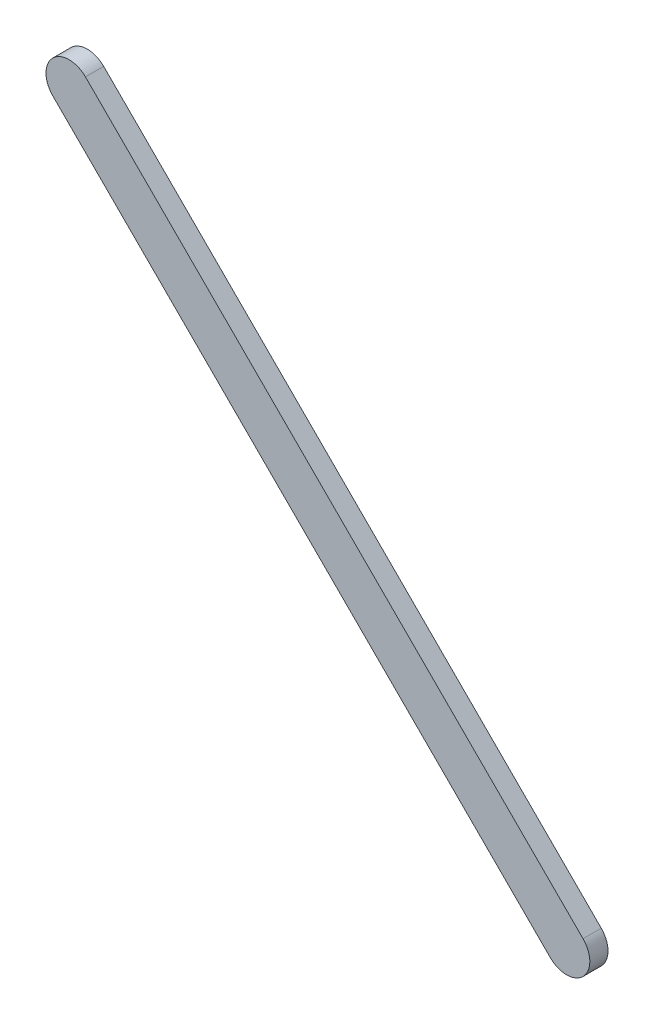
ISO-10303-21;
HEADER;
FILE_DESCRIPTION(('STEP AP214'),'2;1');
FILE_NAME('part.step','',(''),(''),'','','');
FILE_SCHEMA(('AUTOMOTIVE_DESIGN { 1 0 10303 214 1 1 1 1 }'));
ENDSEC;
DATA;
#1=APPLICATION_CONTEXT('core data for automotive mechanical design processes');
#2=APPLICATION_PROTOCOL_DEFINITION('international standard','automotive_design',2000,#1);
#3=PRODUCT_CONTEXT('',#1,'mechanical');
#4=PRODUCT('Part','Part','',(#3));
#5=PRODUCT_RELATED_PRODUCT_CATEGORY('part','',(#4));
#6=PRODUCT_DEFINITION_FORMATION('','',#4);
#7=PRODUCT_DEFINITION_CONTEXT('part definition',#1,'design');
#8=PRODUCT_DEFINITION('design','',#6,#7);
#9=PRODUCT_DEFINITION_SHAPE('','',#8);
#10=(LENGTH_UNIT() NAMED_UNIT(*) SI_UNIT(.MILLI.,.METRE.));
#11=(NAMED_UNIT(*) PLANE_ANGLE_UNIT() SI_UNIT($,.RADIAN.));
#12=(NAMED_UNIT(*) SI_UNIT($,.STERADIAN.) SOLID_ANGLE_UNIT());
#13=UNCERTAINTY_MEASURE_WITH_UNIT(LENGTH_MEASURE(1.E-05),#10,'distance_accuracy_value','');
#14=(GEOMETRIC_REPRESENTATION_CONTEXT(3) GLOBAL_UNCERTAINTY_ASSIGNED_CONTEXT((#13)) GLOBAL_UNIT_ASSIGNED_CONTEXT((#10,
#11,#12)) REPRESENTATION_CONTEXT('',''));
#15=CARTESIAN_POINT('',(0.,0.,0.));
#16=DIRECTION('',(0.,0.,1.));
#17=DIRECTION('',(1.,0.,0.));
#18=AXIS2_PLACEMENT_3D('',#15,#16,#17);
#19=CARTESIAN_POINT('',(85.29139406,56.4623966,0.));
#20=DIRECTION('',(0.707106781186548,0.707106781186547,0.));
#21=DIRECTION('',(0.707106781186547,-0.707106781186548,0.));
#22=AXIS2_PLACEMENT_3D('',#19,#20,#21);
#23=PLANE('',#22);
#24=DIRECTION('',(0.707106781186547,-0.707106781186548,0.));
#25=VECTOR('',#24,1.);
#26=CARTESIAN_POINT('',(85.29139406,56.4623966,0.1999996));
#27=LINE('',#26,#25);
#28=CARTESIAN_POINT('',(85.29139406,56.4623966,0.1999996));
#29=VERTEX_POINT('',#28);
#30=CARTESIAN_POINT('',(90.7523966,51.00139406,0.1999996));
#31=VERTEX_POINT('',#30);
#32=EDGE_CURVE('E11',#29,#31,#27,.T.);
#33=ORIENTED_EDGE('',*,*,#32,.F.);
#34=DIRECTION('',(0.,0.,1.));
#35=VECTOR('',#34,1.);
#36=CARTESIAN_POINT('',(85.29139406,56.4623966,0.));
#37=LINE('',#36,#35);
#38=CARTESIAN_POINT('',(85.29139406,56.4623966,0.));
#39=VERTEX_POINT('',#38);
#40=EDGE_CURVE('E24',#39,#29,#37,.T.);
#41=ORIENTED_EDGE('',*,*,#40,.F.);
#42=DIRECTION('',(0.707106781186547,-0.707106781186548,0.));
#43=VECTOR('',#42,1.);
#44=CARTESIAN_POINT('',(85.29139406,56.4623966,0.));
#45=LINE('',#44,#43);
#46=CARTESIAN_POINT('',(90.7523966,51.00139406,0.));
#47=VERTEX_POINT('',#46);
#48=EDGE_CURVE('E75',#39,#47,#45,.T.);
#49=ORIENTED_EDGE('',*,*,#48,.T.);
#50=DIRECTION('',(0.,0.,1.));
#51=VECTOR('',#50,1.);
#52=CARTESIAN_POINT('',(90.7523966,51.00139406,0.));
#53=LINE('',#52,#51);
#54=EDGE_CURVE('E37',#47,#31,#53,.T.);
#55=ORIENTED_EDGE('',*,*,#54,.T.);
#56=EDGE_LOOP('',(#33,#41,#49,#55));
#57=FACE_BOUND('',#56,.T.);
#58=ADVANCED_FACE('F17',(#57),#23,.F.);
#59=CARTESIAN_POINT('',(90.93200127,51.18099873,0.));
#60=DIRECTION('',(0.,0.,-1.));
#61=DIRECTION('',(-0.707106781186548,-0.707106781186548,0.));
#62=AXIS2_PLACEMENT_3D('',#59,#60,#61);
#63=CYLINDRICAL_SURFACE('',#62,0.253999360179541);
#64=CARTESIAN_POINT('',(90.93200127,51.18099873,0.1999996));
#65=DIRECTION('',(0.,0.,1.));
#66=DIRECTION('',(-0.707106781186548,-0.707106781186548,0.));
#67=AXIS2_PLACEMENT_3D('',#64,#65,#66);
#68=CIRCLE('',#67,0.253999360179541);
#69=CARTESIAN_POINT('',(91.11160594,51.3606034,0.1999996));
#70=VERTEX_POINT('',#69);
#71=EDGE_CURVE('E83',#31,#70,#68,.T.);
#72=ORIENTED_EDGE('',*,*,#71,.F.);
#73=ORIENTED_EDGE('',*,*,#54,.F.);
#74=CARTESIAN_POINT('',(90.93200127,51.18099873,0.));
#75=DIRECTION('',(0.,0.,1.));
#76=DIRECTION('',(-0.707106781186548,-0.707106781186548,0.));
#77=AXIS2_PLACEMENT_3D('',#74,#75,#76);
#78=CIRCLE('',#77,0.253999360179541);
#79=CARTESIAN_POINT('',(91.11160594,51.3606034,0.));
#80=VERTEX_POINT('',#79);
#81=EDGE_CURVE('E81',#47,#80,#78,.T.);
#82=ORIENTED_EDGE('',*,*,#81,.T.);
#83=DIRECTION('',(0.,0.,1.));
#84=VECTOR('',#83,1.);
#85=CARTESIAN_POINT('',(91.11160594,51.3606034,0.));
#86=LINE('',#85,#84);
#87=EDGE_CURVE('E67',#80,#70,#86,.T.);
#88=ORIENTED_EDGE('',*,*,#87,.T.);
#89=EDGE_LOOP('',(#72,#73,#82,#88));
#90=FACE_BOUND('',#89,.T.);
#91=ADVANCED_FACE('F89',(#90),#63,.T.);
#92=CARTESIAN_POINT('',(91.11160594,51.3606034,0.));
#93=DIRECTION('',(-0.707106781186549,-0.707106781186547,0.));
#94=DIRECTION('',(-0.707106781186547,0.707106781186549,0.));
#95=AXIS2_PLACEMENT_3D('',#92,#93,#94);
#96=PLANE('',#95);
#97=DIRECTION('',(-0.707106781186547,0.707106781186549,0.));
#98=VECTOR('',#97,1.);
#99=CARTESIAN_POINT('',(91.11160594,51.3606034,0.1999996));
#100=LINE('',#99,#98);
#101=CARTESIAN_POINT('',(85.6506034,56.82160594,0.1999996));
#102=VERTEX_POINT('',#101);
#103=EDGE_CURVE('E71',#70,#102,#100,.T.);
#104=ORIENTED_EDGE('',*,*,#103,.F.);
#105=ORIENTED_EDGE('',*,*,#87,.F.);
#106=DIRECTION('',(-0.707106781186547,0.707106781186549,0.));
#107=VECTOR('',#106,1.);
#108=CARTESIAN_POINT('',(91.11160594,51.3606034,0.));
#109=LINE('',#108,#107);
#110=CARTESIAN_POINT('',(85.6506034,56.82160594,0.));
#111=VERTEX_POINT('',#110);
#112=EDGE_CURVE('E63',#80,#111,#109,.T.);
#113=ORIENTED_EDGE('',*,*,#112,.T.);
#114=DIRECTION('',(0.,0.,1.));
#115=VECTOR('',#114,1.);
#116=CARTESIAN_POINT('',(85.6506034,56.82160594,0.));
#117=LINE('',#116,#115);
#118=EDGE_CURVE('E53',#111,#102,#117,.T.);
#119=ORIENTED_EDGE('',*,*,#118,.T.);
#120=EDGE_LOOP('',(#104,#105,#113,#119));
#121=FACE_BOUND('',#120,.T.);
#122=ADVANCED_FACE('F66',(#121),#96,.F.);
#123=CARTESIAN_POINT('',(85.47099873,56.64200127,0.));
#124=DIRECTION('',(0.,0.,-1.));
#125=DIRECTION('',(0.707106781186548,0.707106781186548,0.));
#126=AXIS2_PLACEMENT_3D('',#123,#124,#125);
#127=CYLINDRICAL_SURFACE('',#126,0.253999360179542);
#128=CARTESIAN_POINT('',(85.47099873,56.64200127,0.1999996));
#129=DIRECTION('',(0.,0.,1.));
#130=DIRECTION('',(0.707106781186548,0.707106781186548,0.));
#131=AXIS2_PLACEMENT_3D('',#128,#129,#130);
#132=CIRCLE('',#131,0.253999360179542);
#133=EDGE_CURVE('E59',#102,#29,#132,.T.);
#134=ORIENTED_EDGE('',*,*,#133,.F.);
#135=ORIENTED_EDGE('',*,*,#118,.F.);
#136=CARTESIAN_POINT('',(85.47099873,56.64200127,0.));
#137=DIRECTION('',(0.,0.,1.));
#138=DIRECTION('',(0.707106781186548,0.707106781186548,0.));
#139=AXIS2_PLACEMENT_3D('',#136,#137,#138);
#140=CIRCLE('',#139,0.253999360179542);
#141=EDGE_CURVE('E57',#111,#39,#140,.T.);
#142=ORIENTED_EDGE('',*,*,#141,.T.);
#143=ORIENTED_EDGE('',*,*,#40,.T.);
#144=EDGE_LOOP('',(#134,#135,#142,#143));
#145=FACE_BOUND('',#144,.T.);
#146=ADVANCED_FACE('F55',(#145),#127,.T.);
#147=CARTESIAN_POINT('',(85.29139406,56.4623966,0.));
#148=DIRECTION('',(0.,0.,-1.));
#149=DIRECTION('',(-1.,0.,0.));
#150=AXIS2_PLACEMENT_3D('',#147,#148,#149);
#151=PLANE('',#150);
#152=ORIENTED_EDGE('',*,*,#141,.F.);
#153=ORIENTED_EDGE('',*,*,#112,.F.);
#154=ORIENTED_EDGE('',*,*,#81,.F.);
#155=ORIENTED_EDGE('',*,*,#48,.F.);
#156=EDGE_LOOP('',(#152,#153,#154,#155));
#157=FACE_BOUND('',#156,.T.);
#158=ADVANCED_FACE('F74',(#157),#151,.T.);
#159=CARTESIAN_POINT('',(85.29139406,56.4623966,0.1999996));
#160=DIRECTION('',(0.,0.,-1.));
#161=DIRECTION('',(-1.,0.,0.));
#162=AXIS2_PLACEMENT_3D('',#159,#160,#161);
#163=PLANE('',#162);
#164=ORIENTED_EDGE('',*,*,#32,.T.);
#165=ORIENTED_EDGE('',*,*,#71,.T.);
#166=ORIENTED_EDGE('',*,*,#103,.T.);
#167=ORIENTED_EDGE('',*,*,#133,.T.);
#168=EDGE_LOOP('',(#164,#165,#166,#167));
#169=FACE_BOUND('',#168,.T.);
#170=ADVANCED_FACE('F91',(#169),#163,.F.);
#171=CLOSED_SHELL('',(#58,#91,#122,#146,#158,#170));
#172=MANIFOLD_SOLID_BREP('B1',#171);
#173=ADVANCED_BREP_SHAPE_REPRESENTATION('',(#18,#172),#14);
#174=SHAPE_DEFINITION_REPRESENTATION(#9,#173);
ENDSEC;
END-ISO-10303-21;
